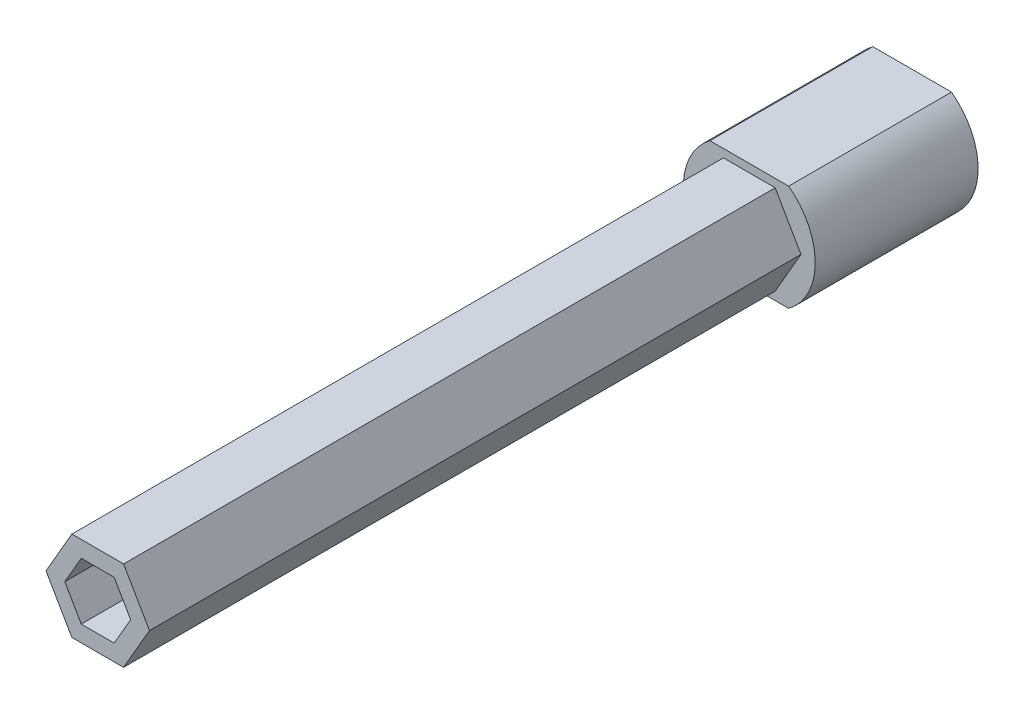
ISO-10303-21;
HEADER;
FILE_DESCRIPTION(('STEP AP214'),'2;1');
FILE_NAME('part.step','',(''),(''),'','','');
FILE_SCHEMA(('AUTOMOTIVE_DESIGN { 1 0 10303 214 1 1 1 1 }'));
ENDSEC;
DATA;
#1=APPLICATION_CONTEXT('core data for automotive mechanical design processes');
#2=APPLICATION_PROTOCOL_DEFINITION('international standard','automotive_design',2000,#1);
#3=PRODUCT_CONTEXT('',#1,'mechanical');
#4=PRODUCT('Part','Part','',(#3));
#5=PRODUCT_RELATED_PRODUCT_CATEGORY('part','',(#4));
#6=PRODUCT_DEFINITION_FORMATION('','',#4);
#7=PRODUCT_DEFINITION_CONTEXT('part definition',#1,'design');
#8=PRODUCT_DEFINITION('design','',#6,#7);
#9=PRODUCT_DEFINITION_SHAPE('','',#8);
#10=(LENGTH_UNIT() NAMED_UNIT(*) SI_UNIT(.MILLI.,.METRE.));
#11=(NAMED_UNIT(*) PLANE_ANGLE_UNIT() SI_UNIT($,.RADIAN.));
#12=(NAMED_UNIT(*) SI_UNIT($,.STERADIAN.) SOLID_ANGLE_UNIT());
#13=UNCERTAINTY_MEASURE_WITH_UNIT(LENGTH_MEASURE(1.E-05),#10,'distance_accuracy_value','');
#14=(GEOMETRIC_REPRESENTATION_CONTEXT(3) GLOBAL_UNCERTAINTY_ASSIGNED_CONTEXT((#13)) GLOBAL_UNIT_ASSIGNED_CONTEXT((#10,
#11,#12)) REPRESENTATION_CONTEXT('',''));
#15=CARTESIAN_POINT('',(0.,0.,0.));
#16=DIRECTION('',(0.,0.,1.));
#17=DIRECTION('',(1.,0.,0.));
#18=AXIS2_PLACEMENT_3D('',#15,#16,#17);
#19=CARTESIAN_POINT('',(0.,0.,10.));
#20=DIRECTION('',(0.,0.,-1.));
#21=DIRECTION('',(-1.,0.,0.));
#22=AXIS2_PLACEMENT_3D('',#19,#20,#21);
#23=CYLINDRICAL_SURFACE('',#22,4.05);
#24=CARTESIAN_POINT('',(0.,0.,0.));
#25=DIRECTION('',(0.,0.,1.));
#26=DIRECTION('',(1.,0.,0.));
#27=AXIS2_PLACEMENT_3D('',#24,#25,#26);
#28=CIRCLE('',#27,4.05);
#29=CARTESIAN_POINT('',(-2.41660919471891,3.25,0.));
#30=VERTEX_POINT('',#29);
#31=CARTESIAN_POINT('',(-2.41660919471891,-3.25,0.));
#32=VERTEX_POINT('',#31);
#33=EDGE_CURVE('E356',#30,#32,#28,.T.);
#34=ORIENTED_EDGE('',*,*,#33,.T.);
#35=DIRECTION('',(0.,0.,-1.));
#36=VECTOR('',#35,1.);
#37=CARTESIAN_POINT('',(-2.41660919471891,-3.25,10.));
#38=LINE('',#37,#36);
#39=CARTESIAN_POINT('',(-2.41660919471891,-3.25,10.));
#40=VERTEX_POINT('',#39);
#41=EDGE_CURVE('E185',#40,#32,#38,.T.);
#42=ORIENTED_EDGE('',*,*,#41,.F.);
#43=CARTESIAN_POINT('',(0.,0.,10.));
#44=DIRECTION('',(0.,0.,1.));
#45=DIRECTION('',(1.,0.,0.));
#46=AXIS2_PLACEMENT_3D('',#43,#44,#45);
#47=CIRCLE('',#46,4.05);
#48=CARTESIAN_POINT('',(-2.41660919471891,3.25,10.));
#49=VERTEX_POINT('',#48);
#50=EDGE_CURVE('E366',#49,#40,#47,.T.);
#51=ORIENTED_EDGE('',*,*,#50,.F.);
#52=DIRECTION('',(0.,0.,-1.));
#53=VECTOR('',#52,1.);
#54=CARTESIAN_POINT('',(-2.41660919471891,3.25,10.));
#55=LINE('',#54,#53);
#56=EDGE_CURVE('E380',#49,#30,#55,.T.);
#57=ORIENTED_EDGE('',*,*,#56,.T.);
#58=EDGE_LOOP('',(#34,#42,#51,#57));
#59=FACE_BOUND('',#58,.T.);
#60=ADVANCED_FACE('F45',(#59),#23,.T.);
#61=CARTESIAN_POINT('',(-2.41660919471891,-3.25,10.));
#62=DIRECTION('',(0.,1.,0.));
#63=DIRECTION('',(0.,0.,1.));
#64=AXIS2_PLACEMENT_3D('',#61,#62,#63);
#65=PLANE('',#64);
#66=DIRECTION('',(1.,0.,0.));
#67=VECTOR('',#66,1.);
#68=CARTESIAN_POINT('',(-2.41660919471891,-3.25,0.));
#69=LINE('',#68,#67);
#70=CARTESIAN_POINT('',(2.41660919471891,-3.25,0.));
#71=VERTEX_POINT('',#70);
#72=EDGE_CURVE('E384',#32,#71,#69,.T.);
#73=ORIENTED_EDGE('',*,*,#72,.T.);
#74=DIRECTION('',(0.,0.,-1.));
#75=VECTOR('',#74,1.);
#76=CARTESIAN_POINT('',(2.41660919471891,-3.25,10.));
#77=LINE('',#76,#75);
#78=CARTESIAN_POINT('',(2.41660919471891,-3.25,10.));
#79=VERTEX_POINT('',#78);
#80=EDGE_CURVE('E399',#79,#71,#77,.T.);
#81=ORIENTED_EDGE('',*,*,#80,.F.);
#82=DIRECTION('',(1.,0.,0.));
#83=VECTOR('',#82,1.);
#84=CARTESIAN_POINT('',(-2.41660919471891,-3.25,10.));
#85=LINE('',#84,#83);
#86=EDGE_CURVE('E370',#40,#79,#85,.T.);
#87=ORIENTED_EDGE('',*,*,#86,.F.);
#88=ORIENTED_EDGE('',*,*,#41,.T.);
#89=EDGE_LOOP('',(#73,#81,#87,#88));
#90=FACE_BOUND('',#89,.T.);
#91=ADVANCED_FACE('F406',(#90),#65,.F.);
#92=CARTESIAN_POINT('',(0.,0.,10.));
#93=DIRECTION('',(0.,0.,-1.));
#94=DIRECTION('',(-1.,0.,0.));
#95=AXIS2_PLACEMENT_3D('',#92,#93,#94);
#96=CYLINDRICAL_SURFACE('',#95,4.05);
#97=CARTESIAN_POINT('',(0.,0.,0.));
#98=DIRECTION('',(0.,0.,1.));
#99=DIRECTION('',(1.,0.,0.));
#100=AXIS2_PLACEMENT_3D('',#97,#98,#99);
#101=CIRCLE('',#100,4.05);
#102=CARTESIAN_POINT('',(2.41660919471891,3.25,0.));
#103=VERTEX_POINT('',#102);
#104=EDGE_CURVE('E387',#71,#103,#101,.T.);
#105=ORIENTED_EDGE('',*,*,#104,.T.);
#106=DIRECTION('',(0.,0.,-1.));
#107=VECTOR('',#106,1.);
#108=CARTESIAN_POINT('',(2.41660919471891,3.25,10.));
#109=LINE('',#108,#107);
#110=CARTESIAN_POINT('',(2.41660919471891,3.25,10.));
#111=VERTEX_POINT('',#110);
#112=EDGE_CURVE('E395',#111,#103,#109,.T.);
#113=ORIENTED_EDGE('',*,*,#112,.F.);
#114=CARTESIAN_POINT('',(0.,0.,10.));
#115=DIRECTION('',(0.,0.,1.));
#116=DIRECTION('',(1.,0.,0.));
#117=AXIS2_PLACEMENT_3D('',#114,#115,#116);
#118=CIRCLE('',#117,4.05);
#119=EDGE_CURVE('E374',#79,#111,#118,.T.);
#120=ORIENTED_EDGE('',*,*,#119,.F.);
#121=ORIENTED_EDGE('',*,*,#80,.T.);
#122=EDGE_LOOP('',(#105,#113,#120,#121));
#123=FACE_BOUND('',#122,.T.);
#124=ADVANCED_FACE('F418',(#123),#96,.T.);
#125=CARTESIAN_POINT('',(-2.41660919471891,3.25,10.));
#126=DIRECTION('',(0.,-1.,0.));
#127=DIRECTION('',(0.,0.,-1.));
#128=AXIS2_PLACEMENT_3D('',#125,#126,#127);
#129=PLANE('',#128);
#130=DIRECTION('',(-1.,0.,0.));
#131=VECTOR('',#130,1.);
#132=CARTESIAN_POINT('',(-2.41660919471891,3.25,0.));
#133=LINE('',#132,#131);
#134=EDGE_CURVE('E371',#103,#30,#133,.T.);
#135=ORIENTED_EDGE('',*,*,#134,.T.);
#136=ORIENTED_EDGE('',*,*,#56,.F.);
#137=DIRECTION('',(-1.,0.,0.));
#138=VECTOR('',#137,1.);
#139=CARTESIAN_POINT('',(-2.41660919471891,3.25,10.));
#140=LINE('',#139,#138);
#141=EDGE_CURVE('E377',#111,#49,#140,.T.);
#142=ORIENTED_EDGE('',*,*,#141,.F.);
#143=ORIENTED_EDGE('',*,*,#112,.T.);
#144=EDGE_LOOP('',(#135,#136,#142,#143));
#145=FACE_BOUND('',#144,.T.);
#146=ADVANCED_FACE('F422',(#145),#129,.F.);
#147=CARTESIAN_POINT('',(0.,0.,10.));
#148=DIRECTION('',(0.,0.,1.));
#149=DIRECTION('',(1.,0.,0.));
#150=AXIS2_PLACEMENT_3D('',#147,#148,#149);
#151=PLANE('',#150);
#152=DIRECTION('',(0.999999819928611,-0.000600118943034769,0.));
#153=VECTOR('',#152,1.);
#154=CARTESIAN_POINT('',(-1.58936328146309,-2.74904668801209,10.));
#155=LINE('',#154,#153);
#156=CARTESIAN_POINT('',(-1.58936328146309,-2.74904668801209,10.));
#157=VERTEX_POINT('',#156);
#158=CARTESIAN_POINT('',(1.5860626272764,-2.75095232159528,10.));
#159=VERTEX_POINT('',#158);
#160=EDGE_CURVE('E254',#157,#159,#155,.T.);
#161=ORIENTED_EDGE('',*,*,#160,.F.);
#162=DIRECTION('',(0.499480191714345,-0.866325307309558,0.));
#163=VECTOR('',#162,1.);
#164=CARTESIAN_POINT('',(-3.17542590873949,0.00190563358318807,10.));
#165=LINE('',#164,#163);
#166=CARTESIAN_POINT('',(-3.17542590873949,0.00190563358318807,10.));
#167=VERTEX_POINT('',#166);
#168=EDGE_CURVE('E260',#167,#157,#165,.T.);
#169=ORIENTED_EDGE('',*,*,#168,.F.);
#170=DIRECTION('',(-0.500519628214266,-0.865725188366524,0.));
#171=VECTOR('',#170,1.);
#172=CARTESIAN_POINT('',(-1.5860626272764,2.75095232159527,10.));
#173=LINE('',#172,#171);
#174=CARTESIAN_POINT('',(-1.5860626272764,2.75095232159527,10.));
#175=VERTEX_POINT('',#174);
#176=EDGE_CURVE('E291',#175,#167,#173,.T.);
#177=ORIENTED_EDGE('',*,*,#176,.F.);
#178=DIRECTION('',(-0.999999819928611,0.000600118943034632,0.));
#179=VECTOR('',#178,1.);
#180=CARTESIAN_POINT('',(1.58936328146309,2.74904668801209,10.));
#181=LINE('',#180,#179);
#182=CARTESIAN_POINT('',(1.58936328146309,2.74904668801209,10.));
#183=VERTEX_POINT('',#182);
#184=EDGE_CURVE('E287',#183,#175,#181,.T.);
#185=ORIENTED_EDGE('',*,*,#184,.F.);
#186=DIRECTION('',(-0.499480191714345,0.866325307309558,0.));
#187=VECTOR('',#186,1.);
#188=CARTESIAN_POINT('',(3.17542590873949,-0.00190563358318875,10.));
#189=LINE('',#188,#187);
#190=CARTESIAN_POINT('',(3.17542590873949,-0.00190563358318875,10.));
#191=VERTEX_POINT('',#190);
#192=EDGE_CURVE('E283',#191,#183,#189,.T.);
#193=ORIENTED_EDGE('',*,*,#192,.F.);
#194=DIRECTION('',(0.500519628214266,0.865725188366524,0.));
#195=VECTOR('',#194,1.);
#196=CARTESIAN_POINT('',(1.5860626272764,-2.75095232159528,10.));
#197=LINE('',#196,#195);
#198=EDGE_CURVE('E279',#159,#191,#197,.T.);
#199=ORIENTED_EDGE('',*,*,#198,.F.);
#200=EDGE_LOOP('',(#161,#169,#177,#185,#193,#199));
#201=FACE_BOUND('',#200,.T.);
#202=ORIENTED_EDGE('',*,*,#50,.T.);
#203=ORIENTED_EDGE('',*,*,#86,.T.);
#204=ORIENTED_EDGE('',*,*,#119,.T.);
#205=ORIENTED_EDGE('',*,*,#141,.T.);
#206=EDGE_LOOP('',(#202,#203,#204,#205));
#207=FACE_BOUND('',#206,.T.);
#208=ADVANCED_FACE('F424',(#201,#207),#151,.T.);
#209=CARTESIAN_POINT('',(0.,0.,0.));
#210=DIRECTION('',(0.,0.,1.));
#211=DIRECTION('',(1.,0.,0.));
#212=AXIS2_PLACEMENT_3D('',#209,#210,#211);
#213=PLANE('',#212);
#214=CARTESIAN_POINT('',(0.,0.,0.));
#215=DIRECTION('',(0.,0.,-1.));
#216=DIRECTION('',(-1.,0.,0.));
#217=AXIS2_PLACEMENT_3D('',#214,#215,#216);
#218=CIRCLE('',#217,3.05);
#219=CARTESIAN_POINT('',(-2.0591260281974,-2.25,0.));
#220=VERTEX_POINT('',#219);
#221=CARTESIAN_POINT('',(-2.0591260281974,2.25,0.));
#222=VERTEX_POINT('',#221);
#223=EDGE_CURVE('E342',#220,#222,#218,.T.);
#224=ORIENTED_EDGE('',*,*,#223,.F.);
#225=DIRECTION('',(-1.,0.,0.));
#226=VECTOR('',#225,1.);
#227=CARTESIAN_POINT('',(2.0591260281974,-2.25,0.));
#228=LINE('',#227,#226);
#229=CARTESIAN_POINT('',(2.0591260281974,-2.25,0.));
#230=VERTEX_POINT('',#229);
#231=EDGE_CURVE('E321',#230,#220,#228,.T.);
#232=ORIENTED_EDGE('',*,*,#231,.F.);
#233=CARTESIAN_POINT('',(0.,0.,0.));
#234=DIRECTION('',(0.,0.,-1.));
#235=DIRECTION('',(-1.,0.,0.));
#236=AXIS2_PLACEMENT_3D('',#233,#234,#235);
#237=CIRCLE('',#236,3.05);
#238=CARTESIAN_POINT('',(2.0591260281974,2.25,0.));
#239=VERTEX_POINT('',#238);
#240=EDGE_CURVE('E327',#239,#230,#237,.T.);
#241=ORIENTED_EDGE('',*,*,#240,.F.);
#242=DIRECTION('',(1.,0.,0.));
#243=VECTOR('',#242,1.);
#244=CARTESIAN_POINT('',(-2.0591260281974,2.25,0.));
#245=LINE('',#244,#243);
#246=EDGE_CURVE('E346',#222,#239,#245,.T.);
#247=ORIENTED_EDGE('',*,*,#246,.F.);
#248=EDGE_LOOP('',(#224,#232,#241,#247));
#249=FACE_BOUND('',#248,.T.);
#250=ORIENTED_EDGE('',*,*,#33,.F.);
#251=ORIENTED_EDGE('',*,*,#134,.F.);
#252=ORIENTED_EDGE('',*,*,#104,.F.);
#253=ORIENTED_EDGE('',*,*,#72,.F.);
#254=EDGE_LOOP('',(#250,#251,#252,#253));
#255=FACE_BOUND('',#254,.T.);
#256=ADVANCED_FACE('F414',(#249,#255),#213,.F.);
#257=CARTESIAN_POINT('',(2.0591260281974,-2.25,8.));
#258=DIRECTION('',(0.,-1.,0.));
#259=DIRECTION('',(0.,0.,-1.));
#260=AXIS2_PLACEMENT_3D('',#257,#258,#259);
#261=PLANE('',#260);
#262=ORIENTED_EDGE('',*,*,#231,.T.);
#263=DIRECTION('',(0.,0.,-1.));
#264=VECTOR('',#263,1.);
#265=CARTESIAN_POINT('',(-2.0591260281974,-2.25,8.));
#266=LINE('',#265,#264);
#267=CARTESIAN_POINT('',(-2.0591260281974,-2.25,8.));
#268=VERTEX_POINT('',#267);
#269=EDGE_CURVE('E339',#268,#220,#266,.T.);
#270=ORIENTED_EDGE('',*,*,#269,.F.);
#271=DIRECTION('',(-1.,0.,0.));
#272=VECTOR('',#271,1.);
#273=CARTESIAN_POINT('',(2.0591260281974,-2.25,8.));
#274=LINE('',#273,#272);
#275=CARTESIAN_POINT('',(2.0591260281974,-2.25,8.));
#276=VERTEX_POINT('',#275);
#277=EDGE_CURVE('E322',#276,#268,#274,.T.);
#278=ORIENTED_EDGE('',*,*,#277,.F.);
#279=DIRECTION('',(0.,0.,-1.));
#280=VECTOR('',#279,1.);
#281=CARTESIAN_POINT('',(2.0591260281974,-2.25,8.));
#282=LINE('',#281,#280);
#283=EDGE_CURVE('E353',#276,#230,#282,.T.);
#284=ORIENTED_EDGE('',*,*,#283,.T.);
#285=EDGE_LOOP('',(#262,#270,#278,#284));
#286=FACE_BOUND('',#285,.T.);
#287=ADVANCED_FACE('F433',(#286),#261,.F.);
#288=CARTESIAN_POINT('',(0.,0.,8.));
#289=DIRECTION('',(0.,0.,-1.));
#290=DIRECTION('',(-1.,0.,0.));
#291=AXIS2_PLACEMENT_3D('',#288,#289,#290);
#292=CYLINDRICAL_SURFACE('',#291,3.05);
#293=ORIENTED_EDGE('',*,*,#240,.T.);
#294=ORIENTED_EDGE('',*,*,#283,.F.);
#295=CARTESIAN_POINT('',(0.,0.,8.));
#296=DIRECTION('',(0.,0.,-1.));
#297=DIRECTION('',(-1.,0.,0.));
#298=AXIS2_PLACEMENT_3D('',#295,#296,#297);
#299=CIRCLE('',#298,3.05);
#300=CARTESIAN_POINT('',(2.0591260281974,2.25,8.));
#301=VERTEX_POINT('',#300);
#302=EDGE_CURVE('E335',#301,#276,#299,.T.);
#303=ORIENTED_EDGE('',*,*,#302,.F.);
#304=DIRECTION('',(0.,0.,-1.));
#305=VECTOR('',#304,1.);
#306=CARTESIAN_POINT('',(2.0591260281974,2.25,8.));
#307=LINE('',#306,#305);
#308=EDGE_CURVE('E357',#301,#239,#307,.T.);
#309=ORIENTED_EDGE('',*,*,#308,.T.);
#310=EDGE_LOOP('',(#293,#294,#303,#309));
#311=FACE_BOUND('',#310,.T.);
#312=ADVANCED_FACE('F466',(#311),#292,.F.);
#313=CARTESIAN_POINT('',(-2.0591260281974,2.25,8.));
#314=DIRECTION('',(0.,1.,0.));
#315=DIRECTION('',(-1.,0.,0.));
#316=AXIS2_PLACEMENT_3D('',#313,#314,#315);
#317=PLANE('',#316);
#318=ORIENTED_EDGE('',*,*,#246,.T.);
#319=ORIENTED_EDGE('',*,*,#308,.F.);
#320=DIRECTION('',(1.,0.,0.));
#321=VECTOR('',#320,1.);
#322=CARTESIAN_POINT('',(-2.0591260281974,2.25,8.));
#323=LINE('',#322,#321);
#324=CARTESIAN_POINT('',(-2.0591260281974,2.25,8.));
#325=VERTEX_POINT('',#324);
#326=EDGE_CURVE('E331',#325,#301,#323,.T.);
#327=ORIENTED_EDGE('',*,*,#326,.F.);
#328=DIRECTION('',(0.,0.,-1.));
#329=VECTOR('',#328,1.);
#330=CARTESIAN_POINT('',(-2.0591260281974,2.25,8.));
#331=LINE('',#330,#329);
#332=EDGE_CURVE('E360',#325,#222,#331,.T.);
#333=ORIENTED_EDGE('',*,*,#332,.T.);
#334=EDGE_LOOP('',(#318,#319,#327,#333));
#335=FACE_BOUND('',#334,.T.);
#336=ADVANCED_FACE('F474',(#335),#317,.F.);
#337=CARTESIAN_POINT('',(0.,0.,8.));
#338=DIRECTION('',(0.,0.,-1.));
#339=DIRECTION('',(-1.,0.,0.));
#340=AXIS2_PLACEMENT_3D('',#337,#338,#339);
#341=CYLINDRICAL_SURFACE('',#340,3.05);
#342=ORIENTED_EDGE('',*,*,#223,.T.);
#343=ORIENTED_EDGE('',*,*,#332,.F.);
#344=CARTESIAN_POINT('',(0.,0.,8.));
#345=DIRECTION('',(0.,0.,-1.));
#346=DIRECTION('',(-1.,0.,0.));
#347=AXIS2_PLACEMENT_3D('',#344,#345,#346);
#348=CIRCLE('',#347,3.05);
#349=EDGE_CURVE('E326',#268,#325,#348,.T.);
#350=ORIENTED_EDGE('',*,*,#349,.F.);
#351=ORIENTED_EDGE('',*,*,#269,.T.);
#352=EDGE_LOOP('',(#342,#343,#350,#351));
#353=FACE_BOUND('',#352,.T.);
#354=ADVANCED_FACE('F482',(#353),#341,.F.);
#355=CARTESIAN_POINT('',(0.,0.,8.));
#356=DIRECTION('',(0.,0.,-1.));
#357=DIRECTION('',(-1.,0.,0.));
#358=AXIS2_PLACEMENT_3D('',#355,#356,#357);
#359=PLANE('',#358);
#360=DIRECTION('',(-0.499480191714345,0.866325307309558,0.));
#361=VECTOR('',#360,1.);
#362=CARTESIAN_POINT('',(-1.51606928779173,-0.874090335500105,8.));
#363=LINE('',#362,#361);
#364=CARTESIAN_POINT('',(-1.01141299729469,-1.74939334691678,8.));
#365=VERTEX_POINT('',#364);
#366=CARTESIAN_POINT('',(-2.02072557828876,0.00121267591657453,8.));
#367=VERTEX_POINT('',#366);
#368=EDGE_CURVE('E224',#365,#367,#363,.T.);
#369=ORIENTED_EDGE('',*,*,#368,.F.);
#370=DIRECTION('',(-0.999999819928611,0.000600118943034672,0.));
#371=VECTOR('',#370,1.);
#372=CARTESIAN_POINT('',(-0.00105020815031068,-1.74999968487507,8.));
#373=LINE('',#372,#371);
#374=CARTESIAN_POINT('',(1.00931258099407,-1.75060602283336,8.));
#375=VERTEX_POINT('',#374);
#376=EDGE_CURVE('E226',#375,#365,#373,.T.);
#377=ORIENTED_EDGE('',*,*,#376,.F.);
#378=DIRECTION('',(-0.500519628214266,-0.865725188366524,0.));
#379=VECTOR('',#378,1.);
#380=CARTESIAN_POINT('',(1.51501907964142,-0.875909349374966,8.));
#381=LINE('',#380,#379);
#382=CARTESIAN_POINT('',(2.02072557828876,-0.0012126759165751,8.));
#383=VERTEX_POINT('',#382);
#384=EDGE_CURVE('E192',#383,#375,#381,.T.);
#385=ORIENTED_EDGE('',*,*,#384,.F.);
#386=DIRECTION('',(0.499480191714345,-0.866325307309558,0.));
#387=VECTOR('',#386,1.);
#388=CARTESIAN_POINT('',(1.51606928779173,0.874090335500104,8.));
#389=LINE('',#388,#387);
#390=CARTESIAN_POINT('',(1.01141299729469,1.74939334691678,8.));
#391=VERTEX_POINT('',#390);
#392=EDGE_CURVE('E243',#391,#383,#389,.T.);
#393=ORIENTED_EDGE('',*,*,#392,.F.);
#394=DIRECTION('',(0.999999819928611,-0.000600118943034671,0.));
#395=VECTOR('',#394,1.);
#396=CARTESIAN_POINT('',(0.00105020815031067,1.74999968487507,8.));
#397=LINE('',#396,#395);
#398=CARTESIAN_POINT('',(-1.00931258099407,1.75060602283336,8.));
#399=VERTEX_POINT('',#398);
#400=EDGE_CURVE('E246',#399,#391,#397,.T.);
#401=ORIENTED_EDGE('',*,*,#400,.F.);
#402=DIRECTION('',(0.500519628214266,0.865725188366524,0.));
#403=VECTOR('',#402,1.);
#404=CARTESIAN_POINT('',(-1.51501907964142,0.875909349374966,8.));
#405=LINE('',#404,#403);
#406=EDGE_CURVE('E249',#367,#399,#405,.T.);
#407=ORIENTED_EDGE('',*,*,#406,.F.);
#408=EDGE_LOOP('',(#369,#377,#385,#393,#401,#407));
#409=FACE_BOUND('',#408,.T.);
#410=ORIENTED_EDGE('',*,*,#277,.T.);
#411=ORIENTED_EDGE('',*,*,#349,.T.);
#412=ORIENTED_EDGE('',*,*,#326,.T.);
#413=ORIENTED_EDGE('',*,*,#302,.T.);
#414=EDGE_LOOP('',(#410,#411,#412,#413));
#415=FACE_BOUND('',#414,.T.);
#416=ADVANCED_FACE('F490',(#409,#415),#359,.T.);
#417=CARTESIAN_POINT('',(-1.58936328146309,-2.74904668801209,50.));
#418=DIRECTION('',(0.000600118943034769,0.999999819928611,0.));
#419=DIRECTION('',(-0.999999819928611,0.000600118943034769,0.));
#420=AXIS2_PLACEMENT_3D('',#417,#418,#419);
#421=PLANE('',#420);
#422=ORIENTED_EDGE('',*,*,#160,.T.);
#423=DIRECTION('',(0.,0.,-1.));
#424=VECTOR('',#423,1.);
#425=CARTESIAN_POINT('',(1.5860626272764,-2.75095232159528,50.));
#426=LINE('',#425,#424);
#427=CARTESIAN_POINT('',(1.5860626272764,-2.75095232159528,50.));
#428=VERTEX_POINT('',#427);
#429=EDGE_CURVE('E317',#428,#159,#426,.T.);
#430=ORIENTED_EDGE('',*,*,#429,.F.);
#431=DIRECTION('',(0.999999819928611,-0.000600118943034769,0.));
#432=VECTOR('',#431,1.);
#433=CARTESIAN_POINT('',(-1.58936328146309,-2.74904668801209,50.));
#434=LINE('',#433,#432);
#435=CARTESIAN_POINT('',(-1.58936328146309,-2.74904668801209,50.));
#436=VERTEX_POINT('',#435);
#437=EDGE_CURVE('E255',#436,#428,#434,.T.);
#438=ORIENTED_EDGE('',*,*,#437,.F.);
#439=DIRECTION('',(0.,0.,-1.));
#440=VECTOR('',#439,1.);
#441=CARTESIAN_POINT('',(-1.58936328146309,-2.74904668801209,50.));
#442=LINE('',#441,#440);
#443=EDGE_CURVE('E275',#436,#157,#442,.T.);
#444=ORIENTED_EDGE('',*,*,#443,.T.);
#445=EDGE_LOOP('',(#422,#430,#438,#444));
#446=FACE_BOUND('',#445,.T.);
#447=ADVANCED_FACE('F503',(#446),#421,.F.);
#448=CARTESIAN_POINT('',(1.5860626272764,-2.75095232159528,50.));
#449=DIRECTION('',(-0.865725188366524,0.500519628214266,0.));
#450=DIRECTION('',(-0.500519628214266,-0.865725188366524,0.));
#451=AXIS2_PLACEMENT_3D('',#448,#449,#450);
#452=PLANE('',#451);
#453=ORIENTED_EDGE('',*,*,#198,.T.);
#454=DIRECTION('',(0.,0.,-1.));
#455=VECTOR('',#454,1.);
#456=CARTESIAN_POINT('',(3.17542590873949,-0.00190563358318875,50.));
#457=LINE('',#456,#455);
#458=CARTESIAN_POINT('',(3.17542590873949,-0.00190563358318875,50.));
#459=VERTEX_POINT('',#458);
#460=EDGE_CURVE('E313',#459,#191,#457,.T.);
#461=ORIENTED_EDGE('',*,*,#460,.F.);
#462=DIRECTION('',(0.500519628214266,0.865725188366524,0.));
#463=VECTOR('',#462,1.);
#464=CARTESIAN_POINT('',(1.5860626272764,-2.75095232159528,50.));
#465=LINE('',#464,#463);
#466=EDGE_CURVE('E259',#428,#459,#465,.T.);
#467=ORIENTED_EDGE('',*,*,#466,.F.);
#468=ORIENTED_EDGE('',*,*,#429,.T.);
#469=EDGE_LOOP('',(#453,#461,#467,#468));
#470=FACE_BOUND('',#469,.T.);
#471=ADVANCED_FACE('F514',(#470),#452,.F.);
#472=CARTESIAN_POINT('',(3.17542590873949,-0.00190563358318875,50.));
#473=DIRECTION('',(-0.866325307309558,-0.499480191714345,0.));
#474=DIRECTION('',(0.499480191714345,-0.866325307309558,0.));
#475=AXIS2_PLACEMENT_3D('',#472,#473,#474);
#476=PLANE('',#475);
#477=ORIENTED_EDGE('',*,*,#192,.T.);
#478=DIRECTION('',(0.,0.,-1.));
#479=VECTOR('',#478,1.);
#480=CARTESIAN_POINT('',(1.58936328146309,2.74904668801209,50.));
#481=LINE('',#480,#479);
#482=CARTESIAN_POINT('',(1.58936328146309,2.74904668801209,50.));
#483=VERTEX_POINT('',#482);
#484=EDGE_CURVE('E309',#483,#183,#481,.T.);
#485=ORIENTED_EDGE('',*,*,#484,.F.);
#486=DIRECTION('',(-0.499480191714345,0.866325307309558,0.));
#487=VECTOR('',#486,1.);
#488=CARTESIAN_POINT('',(3.17542590873949,-0.00190563358318875,50.));
#489=LINE('',#488,#487);
#490=EDGE_CURVE('E263',#459,#483,#489,.T.);
#491=ORIENTED_EDGE('',*,*,#490,.F.);
#492=ORIENTED_EDGE('',*,*,#460,.T.);
#493=EDGE_LOOP('',(#477,#485,#491,#492));
#494=FACE_BOUND('',#493,.T.);
#495=ADVANCED_FACE('F524',(#494),#476,.F.);
#496=CARTESIAN_POINT('',(1.58936328146309,2.74904668801209,50.));
#497=DIRECTION('',(-0.000600118943034632,-0.999999819928611,0.));
#498=DIRECTION('',(0.999999819928611,-0.000600118943034632,0.));
#499=AXIS2_PLACEMENT_3D('',#496,#497,#498);
#500=PLANE('',#499);
#501=ORIENTED_EDGE('',*,*,#184,.T.);
#502=DIRECTION('',(0.,0.,-1.));
#503=VECTOR('',#502,1.);
#504=CARTESIAN_POINT('',(-1.5860626272764,2.75095232159527,50.));
#505=LINE('',#504,#503);
#506=CARTESIAN_POINT('',(-1.5860626272764,2.75095232159527,50.));
#507=VERTEX_POINT('',#506);
#508=EDGE_CURVE('E305',#507,#175,#505,.T.);
#509=ORIENTED_EDGE('',*,*,#508,.F.);
#510=DIRECTION('',(-0.999999819928611,0.000600118943034632,0.));
#511=VECTOR('',#510,1.);
#512=CARTESIAN_POINT('',(1.58936328146309,2.74904668801209,50.));
#513=LINE('',#512,#511);
#514=EDGE_CURVE('E266',#483,#507,#513,.T.);
#515=ORIENTED_EDGE('',*,*,#514,.F.);
#516=ORIENTED_EDGE('',*,*,#484,.T.);
#517=EDGE_LOOP('',(#501,#509,#515,#516));
#518=FACE_BOUND('',#517,.T.);
#519=ADVANCED_FACE('F534',(#518),#500,.F.);
#520=CARTESIAN_POINT('',(-1.5860626272764,2.75095232159527,50.));
#521=DIRECTION('',(0.865725188366524,-0.500519628214266,0.));
#522=DIRECTION('',(0.500519628214266,0.865725188366524,0.));
#523=AXIS2_PLACEMENT_3D('',#520,#521,#522);
#524=PLANE('',#523);
#525=ORIENTED_EDGE('',*,*,#176,.T.);
#526=DIRECTION('',(0.,0.,-1.));
#527=VECTOR('',#526,1.);
#528=CARTESIAN_POINT('',(-3.17542590873949,0.00190563358318807,50.));
#529=LINE('',#528,#527);
#530=CARTESIAN_POINT('',(-3.17542590873949,0.00190563358318807,50.));
#531=VERTEX_POINT('',#530);
#532=EDGE_CURVE('E301',#531,#167,#529,.T.);
#533=ORIENTED_EDGE('',*,*,#532,.F.);
#534=DIRECTION('',(-0.500519628214266,-0.865725188366524,0.));
#535=VECTOR('',#534,1.);
#536=CARTESIAN_POINT('',(-1.5860626272764,2.75095232159527,50.));
#537=LINE('',#536,#535);
#538=EDGE_CURVE('E269',#507,#531,#537,.T.);
#539=ORIENTED_EDGE('',*,*,#538,.F.);
#540=ORIENTED_EDGE('',*,*,#508,.T.);
#541=EDGE_LOOP('',(#525,#533,#539,#540));
#542=FACE_BOUND('',#541,.T.);
#543=ADVANCED_FACE('F544',(#542),#524,.F.);
#544=CARTESIAN_POINT('',(-3.17542590873949,0.00190563358318807,50.));
#545=DIRECTION('',(0.866325307309558,0.499480191714345,0.));
#546=DIRECTION('',(-0.499480191714345,0.866325307309558,0.));
#547=AXIS2_PLACEMENT_3D('',#544,#545,#546);
#548=PLANE('',#547);
#549=ORIENTED_EDGE('',*,*,#168,.T.);
#550=ORIENTED_EDGE('',*,*,#443,.F.);
#551=DIRECTION('',(0.499480191714345,-0.866325307309558,0.));
#552=VECTOR('',#551,1.);
#553=CARTESIAN_POINT('',(-3.17542590873949,0.00190563358318807,50.));
#554=LINE('',#553,#552);
#555=EDGE_CURVE('E272',#531,#436,#554,.T.);
#556=ORIENTED_EDGE('',*,*,#555,.F.);
#557=ORIENTED_EDGE('',*,*,#532,.T.);
#558=EDGE_LOOP('',(#549,#550,#556,#557));
#559=FACE_BOUND('',#558,.T.);
#560=ADVANCED_FACE('F554',(#559),#548,.F.);
#561=CARTESIAN_POINT('',(0.,0.,50.));
#562=DIRECTION('',(0.,0.,1.));
#563=DIRECTION('',(1.,0.,0.));
#564=AXIS2_PLACEMENT_3D('',#561,#562,#563);
#565=PLANE('',#564);
#566=DIRECTION('',(0.499480191714345,-0.866325307309558,0.));
#567=VECTOR('',#566,1.);
#568=CARTESIAN_POINT('',(-1.51606928779173,-0.874090335500105,50.));
#569=LINE('',#568,#567);
#570=CARTESIAN_POINT('',(-2.02072557828876,0.00121267591657453,50.));
#571=VERTEX_POINT('',#570);
#572=CARTESIAN_POINT('',(-1.01141299729469,-1.74939334691678,50.));
#573=VERTEX_POINT('',#572);
#574=EDGE_CURVE('E11',#571,#573,#569,.T.);
#575=ORIENTED_EDGE('',*,*,#574,.F.);
#576=DIRECTION('',(-0.500519628214266,-0.865725188366524,0.));
#577=VECTOR('',#576,1.);
#578=CARTESIAN_POINT('',(-1.51501907964142,0.875909349374966,50.));
#579=LINE('',#578,#577);
#580=CARTESIAN_POINT('',(-1.00931258099407,1.75060602283336,50.));
#581=VERTEX_POINT('',#580);
#582=EDGE_CURVE('E53',#581,#571,#579,.T.);
#583=ORIENTED_EDGE('',*,*,#582,.F.);
#584=DIRECTION('',(-0.999999819928611,0.000600118943034671,0.));
#585=VECTOR('',#584,1.);
#586=CARTESIAN_POINT('',(0.00105020815031067,1.74999968487507,50.));
#587=LINE('',#586,#585);
#588=CARTESIAN_POINT('',(1.01141299729469,1.74939334691678,50.));
#589=VERTEX_POINT('',#588);
#590=EDGE_CURVE('E205',#589,#581,#587,.T.);
#591=ORIENTED_EDGE('',*,*,#590,.F.);
#592=DIRECTION('',(-0.499480191714345,0.866325307309558,0.));
#593=VECTOR('',#592,1.);
#594=CARTESIAN_POINT('',(1.51606928779173,0.874090335500104,50.));
#595=LINE('',#594,#593);
#596=CARTESIAN_POINT('',(2.02072557828876,-0.0012126759165751,50.));
#597=VERTEX_POINT('',#596);
#598=EDGE_CURVE('E201',#597,#589,#595,.T.);
#599=ORIENTED_EDGE('',*,*,#598,.F.);
#600=DIRECTION('',(0.500519628214266,0.865725188366524,0.));
#601=VECTOR('',#600,1.);
#602=CARTESIAN_POINT('',(1.51501907964142,-0.875909349374966,50.));
#603=LINE('',#602,#601);
#604=CARTESIAN_POINT('',(1.00931258099407,-1.75060602283336,50.));
#605=VERTEX_POINT('',#604);
#606=EDGE_CURVE('E184',#605,#597,#603,.T.);
#607=ORIENTED_EDGE('',*,*,#606,.F.);
#608=DIRECTION('',(0.999999819928611,-0.000600118943034672,0.));
#609=VECTOR('',#608,1.);
#610=CARTESIAN_POINT('',(-0.00105020815031068,-1.74999968487507,50.));
#611=LINE('',#610,#609);
#612=EDGE_CURVE('E178',#573,#605,#611,.T.);
#613=ORIENTED_EDGE('',*,*,#612,.F.);
#614=EDGE_LOOP('',(#575,#583,#591,#599,#607,#613));
#615=FACE_BOUND('',#614,.T.);
#616=ORIENTED_EDGE('',*,*,#437,.T.);
#617=ORIENTED_EDGE('',*,*,#466,.T.);
#618=ORIENTED_EDGE('',*,*,#490,.T.);
#619=ORIENTED_EDGE('',*,*,#514,.T.);
#620=ORIENTED_EDGE('',*,*,#538,.T.);
#621=ORIENTED_EDGE('',*,*,#555,.T.);
#622=EDGE_LOOP('',(#616,#617,#618,#619,#620,#621));
#623=FACE_BOUND('',#622,.T.);
#624=ADVANCED_FACE('F198',(#615,#623),#565,.T.);
#625=CARTESIAN_POINT('',(-2.02072557828876,0.00121267591657453,0.));
#626=DIRECTION('',(-0.866325307309558,-0.499480191714345,0.));
#627=DIRECTION('',(0.499480191714345,-0.866325307309558,0.));
#628=AXIS2_PLACEMENT_3D('',#625,#626,#627);
#629=PLANE('',#628);
#630=ORIENTED_EDGE('',*,*,#368,.T.);
#631=DIRECTION('',(0.,0.,1.));
#632=VECTOR('',#631,1.);
#633=CARTESIAN_POINT('',(-2.02072557828876,0.00121267591657453,0.));
#634=LINE('',#633,#632);
#635=EDGE_CURVE('E217',#367,#571,#634,.T.);
#636=ORIENTED_EDGE('',*,*,#635,.T.);
#637=ORIENTED_EDGE('',*,*,#574,.T.);
#638=DIRECTION('',(0.,0.,1.));
#639=VECTOR('',#638,1.);
#640=CARTESIAN_POINT('',(-1.01141299729469,-1.74939334691678,0.));
#641=LINE('',#640,#639);
#642=EDGE_CURVE('E65',#365,#573,#641,.T.);
#643=ORIENTED_EDGE('',*,*,#642,.F.);
#644=EDGE_LOOP('',(#630,#636,#637,#643));
#645=FACE_BOUND('',#644,.T.);
#646=ADVANCED_FACE('F222',(#645),#629,.F.);
#647=CARTESIAN_POINT('',(-1.00931258099407,1.75060602283336,0.));
#648=DIRECTION('',(-0.865725188366524,0.500519628214266,0.));
#649=DIRECTION('',(-0.500519628214266,-0.865725188366524,0.));
#650=AXIS2_PLACEMENT_3D('',#647,#648,#649);
#651=PLANE('',#650);
#652=ORIENTED_EDGE('',*,*,#406,.T.);
#653=DIRECTION('',(0.,0.,1.));
#654=VECTOR('',#653,1.);
#655=CARTESIAN_POINT('',(-1.00931258099407,1.75060602283336,0.));
#656=LINE('',#655,#654);
#657=EDGE_CURVE('E220',#399,#581,#656,.T.);
#658=ORIENTED_EDGE('',*,*,#657,.T.);
#659=ORIENTED_EDGE('',*,*,#582,.T.);
#660=ORIENTED_EDGE('',*,*,#635,.F.);
#661=EDGE_LOOP('',(#652,#658,#659,#660));
#662=FACE_BOUND('',#661,.T.);
#663=ADVANCED_FACE('F216',(#662),#651,.F.);
#664=CARTESIAN_POINT('',(1.01141299729469,1.74939334691678,0.));
#665=DIRECTION('',(0.000600118943034671,0.999999819928611,0.));
#666=DIRECTION('',(-0.999999819928611,0.000600118943034671,0.));
#667=AXIS2_PLACEMENT_3D('',#664,#665,#666);
#668=PLANE('',#667);
#669=ORIENTED_EDGE('',*,*,#400,.T.);
#670=DIRECTION('',(0.,0.,1.));
#671=VECTOR('',#670,1.);
#672=CARTESIAN_POINT('',(1.01141299729469,1.74939334691678,0.));
#673=LINE('',#672,#671);
#674=EDGE_CURVE('E231',#391,#589,#673,.T.);
#675=ORIENTED_EDGE('',*,*,#674,.T.);
#676=ORIENTED_EDGE('',*,*,#590,.T.);
#677=ORIENTED_EDGE('',*,*,#657,.F.);
#678=EDGE_LOOP('',(#669,#675,#676,#677));
#679=FACE_BOUND('',#678,.T.);
#680=ADVANCED_FACE('F587',(#679),#668,.F.);
#681=CARTESIAN_POINT('',(2.02072557828876,-0.0012126759165751,0.));
#682=DIRECTION('',(0.866325307309558,0.499480191714345,0.));
#683=DIRECTION('',(-0.499480191714345,0.866325307309558,0.));
#684=AXIS2_PLACEMENT_3D('',#681,#682,#683);
#685=PLANE('',#684);
#686=ORIENTED_EDGE('',*,*,#392,.T.);
#687=DIRECTION('',(0.,0.,1.));
#688=VECTOR('',#687,1.);
#689=CARTESIAN_POINT('',(2.02072557828876,-0.0012126759165751,0.));
#690=LINE('',#689,#688);
#691=EDGE_CURVE('E195',#383,#597,#690,.T.);
#692=ORIENTED_EDGE('',*,*,#691,.T.);
#693=ORIENTED_EDGE('',*,*,#598,.T.);
#694=ORIENTED_EDGE('',*,*,#674,.F.);
#695=EDGE_LOOP('',(#686,#692,#693,#694));
#696=FACE_BOUND('',#695,.T.);
#697=ADVANCED_FACE('F596',(#696),#685,.F.);
#698=CARTESIAN_POINT('',(1.00931258099407,-1.75060602283336,0.));
#699=DIRECTION('',(0.865725188366524,-0.500519628214266,0.));
#700=DIRECTION('',(0.500519628214266,0.865725188366524,0.));
#701=AXIS2_PLACEMENT_3D('',#698,#699,#700);
#702=PLANE('',#701);
#703=ORIENTED_EDGE('',*,*,#384,.T.);
#704=DIRECTION('',(0.,0.,1.));
#705=VECTOR('',#704,1.);
#706=CARTESIAN_POINT('',(1.00931258099407,-1.75060602283336,0.));
#707=LINE('',#706,#705);
#708=EDGE_CURVE('E60',#375,#605,#707,.T.);
#709=ORIENTED_EDGE('',*,*,#708,.T.);
#710=ORIENTED_EDGE('',*,*,#606,.T.);
#711=ORIENTED_EDGE('',*,*,#691,.F.);
#712=EDGE_LOOP('',(#703,#709,#710,#711));
#713=FACE_BOUND('',#712,.T.);
#714=ADVANCED_FACE('F188',(#713),#702,.F.);
#715=CARTESIAN_POINT('',(-1.01141299729469,-1.74939334691678,0.));
#716=DIRECTION('',(-0.000600118943034672,-0.999999819928611,0.));
#717=DIRECTION('',(0.999999819928611,-0.000600118943034672,0.));
#718=AXIS2_PLACEMENT_3D('',#715,#716,#717);
#719=PLANE('',#718);
#720=ORIENTED_EDGE('',*,*,#376,.T.);
#721=ORIENTED_EDGE('',*,*,#642,.T.);
#722=ORIENTED_EDGE('',*,*,#612,.T.);
#723=ORIENTED_EDGE('',*,*,#708,.F.);
#724=EDGE_LOOP('',(#720,#721,#722,#723));
#725=FACE_BOUND('',#724,.T.);
#726=ADVANCED_FACE('F179',(#725),#719,.F.);
#727=CLOSED_SHELL('',(#60,#91,#124,#146,#208,#256,#287,#312,#336,#354,#416,#447,#471,#495,#519,
#543,#560,#624,#646,#663,#680,#697,#714,#726));
#728=MANIFOLD_SOLID_BREP('B2',#727);
#729=ADVANCED_BREP_SHAPE_REPRESENTATION('',(#18,#728),#14);
#730=SHAPE_DEFINITION_REPRESENTATION(#9,#729);
ENDSEC;
END-ISO-10303-21;
